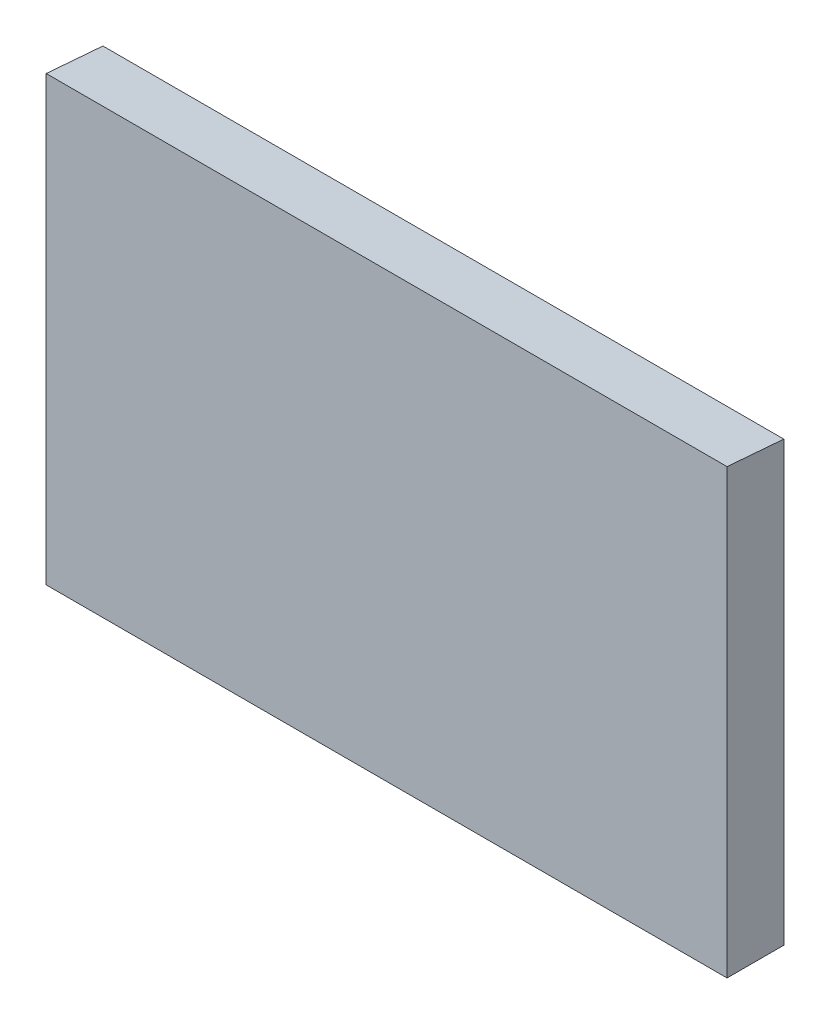
ISO-10303-21;
HEADER;
FILE_DESCRIPTION(('STEP AP214'),'2;1');
FILE_NAME('part.step','',(''),(''),'','','');
FILE_SCHEMA(('AUTOMOTIVE_DESIGN { 1 0 10303 214 1 1 1 1 }'));
ENDSEC;
DATA;
#1=APPLICATION_CONTEXT('core data for automotive mechanical design processes');
#2=APPLICATION_PROTOCOL_DEFINITION('international standard','automotive_design',2000,#1);
#3=PRODUCT_CONTEXT('',#1,'mechanical');
#4=PRODUCT('Part','Part','',(#3));
#5=PRODUCT_RELATED_PRODUCT_CATEGORY('part','',(#4));
#6=PRODUCT_DEFINITION_FORMATION('','',#4);
#7=PRODUCT_DEFINITION_CONTEXT('part definition',#1,'design');
#8=PRODUCT_DEFINITION('design','',#6,#7);
#9=PRODUCT_DEFINITION_SHAPE('','',#8);
#10=(LENGTH_UNIT() NAMED_UNIT(*) SI_UNIT(.MILLI.,.METRE.));
#11=(NAMED_UNIT(*) PLANE_ANGLE_UNIT() SI_UNIT($,.RADIAN.));
#12=(NAMED_UNIT(*) SI_UNIT($,.STERADIAN.) SOLID_ANGLE_UNIT());
#13=UNCERTAINTY_MEASURE_WITH_UNIT(LENGTH_MEASURE(1.E-05),#10,'distance_accuracy_value','');
#14=(GEOMETRIC_REPRESENTATION_CONTEXT(3) GLOBAL_UNCERTAINTY_ASSIGNED_CONTEXT((#13)) GLOBAL_UNIT_ASSIGNED_CONTEXT((#10,
#11,#12)) REPRESENTATION_CONTEXT('',''));
#15=CARTESIAN_POINT('',(0.,0.,0.));
#16=DIRECTION('',(0.,0.,1.));
#17=DIRECTION('',(1.,0.,0.));
#18=AXIS2_PLACEMENT_3D('',#15,#16,#17);
#19=CARTESIAN_POINT('',(180.,-57.84,-7.5));
#20=DIRECTION('',(0.,0.,1.));
#21=DIRECTION('',(1.,0.,0.));
#22=AXIS2_PLACEMENT_3D('',#19,#20,#21);
#23=PLANE('',#22);
#24=DIRECTION('',(0.,1.,0.));
#25=VECTOR('',#24,1.);
#26=CARTESIAN_POINT('',(0.,-57.84,-7.5));
#27=LINE('',#26,#25);
#28=CARTESIAN_POINT('',(0.,-57.84,-7.5));
#29=VERTEX_POINT('',#28);
#30=CARTESIAN_POINT('',(0.,58.04,-7.5));
#31=VERTEX_POINT('',#30);
#32=EDGE_CURVE('E98',#29,#31,#27,.T.);
#33=ORIENTED_EDGE('',*,*,#32,.T.);
#34=DIRECTION('',(1.,0.,0.));
#35=VECTOR('',#34,1.);
#36=CARTESIAN_POINT('',(0.,58.04,-7.5));
#37=LINE('',#36,#35);
#38=CARTESIAN_POINT('',(180.,58.04,-7.5));
#39=VERTEX_POINT('',#38);
#40=EDGE_CURVE('E99',#31,#39,#37,.T.);
#41=ORIENTED_EDGE('',*,*,#40,.T.);
#42=DIRECTION('',(0.,1.,0.));
#43=VECTOR('',#42,1.);
#44=CARTESIAN_POINT('',(180.,-57.84,-7.5));
#45=LINE('',#44,#43);
#46=CARTESIAN_POINT('',(180.,-57.84,-7.5));
#47=VERTEX_POINT('',#46);
#48=EDGE_CURVE('E89',#47,#39,#45,.T.);
#49=ORIENTED_EDGE('',*,*,#48,.F.);
#50=DIRECTION('',(-1.,0.,0.));
#51=VECTOR('',#50,1.);
#52=CARTESIAN_POINT('',(180.,-57.84,-7.5));
#53=LINE('',#52,#51);
#54=EDGE_CURVE('E50',#47,#29,#53,.T.);
#55=ORIENTED_EDGE('',*,*,#54,.T.);
#56=EDGE_LOOP('',(#33,#41,#49,#55));
#57=FACE_BOUND('',#56,.T.);
#58=ADVANCED_FACE('F41',(#57),#23,.F.);
#59=CARTESIAN_POINT('',(180.,-57.84,7.5));
#60=DIRECTION('',(0.,0.,-1.));
#61=DIRECTION('',(-1.,0.,0.));
#62=AXIS2_PLACEMENT_3D('',#59,#60,#61);
#63=PLANE('',#62);
#64=DIRECTION('',(0.,-1.,0.));
#65=VECTOR('',#64,1.);
#66=CARTESIAN_POINT('',(0.,-57.84,7.5));
#67=LINE('',#66,#65);
#68=CARTESIAN_POINT('',(0.,59.24,7.5));
#69=VERTEX_POINT('',#68);
#70=CARTESIAN_POINT('',(0.,-57.84,7.5));
#71=VERTEX_POINT('',#70);
#72=EDGE_CURVE('E69',#69,#71,#67,.T.);
#73=ORIENTED_EDGE('',*,*,#72,.T.);
#74=DIRECTION('',(-1.,0.,0.));
#75=VECTOR('',#74,1.);
#76=CARTESIAN_POINT('',(180.,-57.84,7.5));
#77=LINE('',#76,#75);
#78=CARTESIAN_POINT('',(180.,-57.84,7.5));
#79=VERTEX_POINT('',#78);
#80=EDGE_CURVE('E11',#79,#71,#77,.T.);
#81=ORIENTED_EDGE('',*,*,#80,.F.);
#82=DIRECTION('',(0.,-1.,0.));
#83=VECTOR('',#82,1.);
#84=CARTESIAN_POINT('',(180.,-57.84,7.5));
#85=LINE('',#84,#83);
#86=CARTESIAN_POINT('',(180.,59.24,7.5));
#87=VERTEX_POINT('',#86);
#88=EDGE_CURVE('E82',#87,#79,#85,.T.);
#89=ORIENTED_EDGE('',*,*,#88,.F.);
#90=DIRECTION('',(1.,0.,0.));
#91=VECTOR('',#90,1.);
#92=CARTESIAN_POINT('',(0.,59.24,7.5));
#93=LINE('',#92,#91);
#94=EDGE_CURVE('E85',#69,#87,#93,.T.);
#95=ORIENTED_EDGE('',*,*,#94,.F.);
#96=EDGE_LOOP('',(#73,#81,#89,#95));
#97=FACE_BOUND('',#96,.T.);
#98=ADVANCED_FACE('F84',(#97),#63,.F.);
#99=CARTESIAN_POINT('',(180.,-57.84,7.5));
#100=DIRECTION('',(0.,1.,0.));
#101=DIRECTION('',(0.,0.,1.));
#102=AXIS2_PLACEMENT_3D('',#99,#100,#101);
#103=PLANE('',#102);
#104=DIRECTION('',(0.,0.,-1.));
#105=VECTOR('',#104,1.);
#106=CARTESIAN_POINT('',(0.,-57.84,7.5));
#107=LINE('',#106,#105);
#108=EDGE_CURVE('E112',#71,#29,#107,.T.);
#109=ORIENTED_EDGE('',*,*,#108,.T.);
#110=ORIENTED_EDGE('',*,*,#54,.F.);
#111=DIRECTION('',(0.,0.,-1.));
#112=VECTOR('',#111,1.);
#113=CARTESIAN_POINT('',(180.,-57.84,7.5));
#114=LINE('',#113,#112);
#115=EDGE_CURVE('E58',#79,#47,#114,.T.);
#116=ORIENTED_EDGE('',*,*,#115,.F.);
#117=ORIENTED_EDGE('',*,*,#80,.T.);
#118=EDGE_LOOP('',(#109,#110,#116,#117));
#119=FACE_BOUND('',#118,.T.);
#120=ADVANCED_FACE('F127',(#119),#103,.F.);
#121=CARTESIAN_POINT('',(180.,0.,0.));
#122=DIRECTION('',(-1.,0.,0.));
#123=DIRECTION('',(0.,0.,1.));
#124=AXIS2_PLACEMENT_3D('',#121,#122,#123);
#125=PLANE('',#124);
#126=ORIENTED_EDGE('',*,*,#48,.T.);
#127=DIRECTION('',(0.,0.07974522228289,0.996815278536125));
#128=VECTOR('',#127,1.);
#129=CARTESIAN_POINT('',(180.,58.04,-7.5));
#130=LINE('',#129,#128);
#131=EDGE_CURVE('E95',#39,#87,#130,.T.);
#132=ORIENTED_EDGE('',*,*,#131,.T.);
#133=ORIENTED_EDGE('',*,*,#88,.T.);
#134=ORIENTED_EDGE('',*,*,#115,.T.);
#135=EDGE_LOOP('',(#126,#132,#133,#134));
#136=FACE_BOUND('',#135,.T.);
#137=ADVANCED_FACE('F101',(#136),#125,.F.);
#138=CARTESIAN_POINT('',(0.,0.,0.));
#139=DIRECTION('',(-1.,0.,0.));
#140=DIRECTION('',(0.,0.,1.));
#141=AXIS2_PLACEMENT_3D('',#138,#139,#140);
#142=PLANE('',#141);
#143=ORIENTED_EDGE('',*,*,#32,.F.);
#144=ORIENTED_EDGE('',*,*,#108,.F.);
#145=ORIENTED_EDGE('',*,*,#72,.F.);
#146=DIRECTION('',(0.,0.07974522228289,0.996815278536125));
#147=VECTOR('',#146,1.);
#148=CARTESIAN_POINT('',(0.,58.04,-7.5));
#149=LINE('',#148,#147);
#150=EDGE_CURVE('E96',#31,#69,#149,.T.);
#151=ORIENTED_EDGE('',*,*,#150,.F.);
#152=EDGE_LOOP('',(#143,#144,#145,#151));
#153=FACE_BOUND('',#152,.T.);
#154=ADVANCED_FACE('F126',(#153),#142,.T.);
#155=CARTESIAN_POINT('',(0.,58.04,-7.5));
#156=DIRECTION('',(0.,0.996815278536125,-0.07974522228289));
#157=DIRECTION('',(0.,0.07974522228289,0.996815278536125));
#158=AXIS2_PLACEMENT_3D('',#155,#156,#157);
#159=PLANE('',#158);
#160=ORIENTED_EDGE('',*,*,#131,.F.);
#161=ORIENTED_EDGE('',*,*,#40,.F.);
#162=ORIENTED_EDGE('',*,*,#150,.T.);
#163=ORIENTED_EDGE('',*,*,#94,.T.);
#164=EDGE_LOOP('',(#160,#161,#162,#163));
#165=FACE_BOUND('',#164,.T.);
#166=ADVANCED_FACE('F93',(#165),#159,.T.);
#167=CLOSED_SHELL('',(#58,#98,#120,#137,#154,#166));
#168=MANIFOLD_SOLID_BREP('B2',#167);
#169=ADVANCED_BREP_SHAPE_REPRESENTATION('',(#18,#168),#14);
#170=SHAPE_DEFINITION_REPRESENTATION(#9,#169);
ENDSEC;
END-ISO-10303-21;
